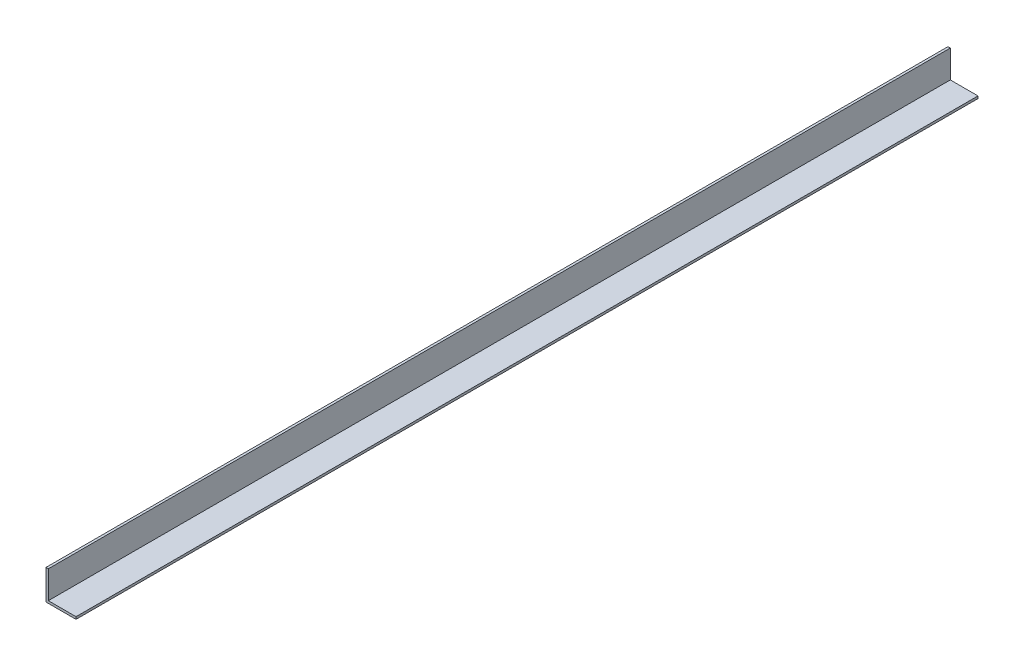
ISO-10303-21;
HEADER;
FILE_DESCRIPTION(('STEP AP214'),'2;1');
FILE_NAME('part.step','',(''),(''),'','','');
FILE_SCHEMA(('AUTOMOTIVE_DESIGN { 1 0 10303 214 1 1 1 1 }'));
ENDSEC;
DATA;
#1=APPLICATION_CONTEXT('core data for automotive mechanical design processes');
#2=APPLICATION_PROTOCOL_DEFINITION('international standard','automotive_design',2000,#1);
#3=PRODUCT_CONTEXT('',#1,'mechanical');
#4=PRODUCT('Part','Part','',(#3));
#5=PRODUCT_RELATED_PRODUCT_CATEGORY('part','',(#4));
#6=PRODUCT_DEFINITION_FORMATION('','',#4);
#7=PRODUCT_DEFINITION_CONTEXT('part definition',#1,'design');
#8=PRODUCT_DEFINITION('design','',#6,#7);
#9=PRODUCT_DEFINITION_SHAPE('','',#8);
#10=(LENGTH_UNIT() NAMED_UNIT(*) SI_UNIT(.MILLI.,.METRE.));
#11=(NAMED_UNIT(*) PLANE_ANGLE_UNIT() SI_UNIT($,.RADIAN.));
#12=(NAMED_UNIT(*) SI_UNIT($,.STERADIAN.) SOLID_ANGLE_UNIT());
#13=UNCERTAINTY_MEASURE_WITH_UNIT(LENGTH_MEASURE(1.E-05),#10,'distance_accuracy_value','');
#14=(GEOMETRIC_REPRESENTATION_CONTEXT(3) GLOBAL_UNCERTAINTY_ASSIGNED_CONTEXT((#13)) GLOBAL_UNIT_ASSIGNED_CONTEXT((#10,
#11,#12)) REPRESENTATION_CONTEXT('',''));
#15=CARTESIAN_POINT('',(0.,0.,0.));
#16=DIRECTION('',(0.,0.,1.));
#17=DIRECTION('',(1.,0.,0.));
#18=AXIS2_PLACEMENT_3D('',#15,#16,#17);
#19=CARTESIAN_POINT('',(15.88,203.,-6100.));
#20=DIRECTION('',(0.,1.,0.));
#21=DIRECTION('',(0.,0.,1.));
#22=AXIS2_PLACEMENT_3D('',#19,#20,#21);
#23=PLANE('',#22);
#24=DIRECTION('',(-1.,0.,0.));
#25=VECTOR('',#24,1.);
#26=CARTESIAN_POINT('',(15.88,203.,0.));
#27=LINE('',#26,#25);
#28=CARTESIAN_POINT('',(15.88,203.,0.));
#29=VERTEX_POINT('',#28);
#30=CARTESIAN_POINT('',(0.,203.,0.));
#31=VERTEX_POINT('',#30);
#32=EDGE_CURVE('E118',#29,#31,#27,.T.);
#33=ORIENTED_EDGE('',*,*,#32,.F.);
#34=DIRECTION('',(0.,0.,1.));
#35=VECTOR('',#34,1.);
#36=CARTESIAN_POINT('',(15.88,203.,-6100.));
#37=LINE('',#36,#35);
#38=CARTESIAN_POINT('',(15.88,203.,-6100.));
#39=VERTEX_POINT('',#38);
#40=EDGE_CURVE('E11',#39,#29,#37,.T.);
#41=ORIENTED_EDGE('',*,*,#40,.F.);
#42=DIRECTION('',(-1.,0.,0.));
#43=VECTOR('',#42,1.);
#44=CARTESIAN_POINT('',(15.88,203.,-6100.));
#45=LINE('',#44,#43);
#46=CARTESIAN_POINT('',(0.,203.,-6100.));
#47=VERTEX_POINT('',#46);
#48=EDGE_CURVE('E132',#39,#47,#45,.T.);
#49=ORIENTED_EDGE('',*,*,#48,.T.);
#50=DIRECTION('',(0.,0.,1.));
#51=VECTOR('',#50,1.);
#52=CARTESIAN_POINT('',(0.,203.,-6100.));
#53=LINE('',#52,#51);
#54=EDGE_CURVE('E36',#47,#31,#53,.T.);
#55=ORIENTED_EDGE('',*,*,#54,.T.);
#56=EDGE_LOOP('',(#33,#41,#49,#55));
#57=FACE_BOUND('',#56,.T.);
#58=ADVANCED_FACE('F33',(#57),#23,.T.);
#59=CARTESIAN_POINT('',(15.88,15.88,-6100.));
#60=DIRECTION('',(1.,0.,0.));
#61=DIRECTION('',(0.,1.,0.));
#62=AXIS2_PLACEMENT_3D('',#59,#60,#61);
#63=PLANE('',#62);
#64=DIRECTION('',(0.,1.,0.));
#65=VECTOR('',#64,1.);
#66=CARTESIAN_POINT('',(15.88,15.88,0.));
#67=LINE('',#66,#65);
#68=CARTESIAN_POINT('',(15.88,15.88,0.));
#69=VERTEX_POINT('',#68);
#70=EDGE_CURVE('E130',#69,#29,#67,.T.);
#71=ORIENTED_EDGE('',*,*,#70,.F.);
#72=DIRECTION('',(0.,0.,1.));
#73=VECTOR('',#72,1.);
#74=CARTESIAN_POINT('',(15.88,15.88,-6100.));
#75=LINE('',#74,#73);
#76=CARTESIAN_POINT('',(15.88,15.88,-6100.));
#77=VERTEX_POINT('',#76);
#78=EDGE_CURVE('E42',#77,#69,#75,.T.);
#79=ORIENTED_EDGE('',*,*,#78,.F.);
#80=DIRECTION('',(0.,1.,0.));
#81=VECTOR('',#80,1.);
#82=CARTESIAN_POINT('',(15.88,15.88,-6100.));
#83=LINE('',#82,#81);
#84=EDGE_CURVE('E108',#77,#39,#83,.T.);
#85=ORIENTED_EDGE('',*,*,#84,.T.);
#86=ORIENTED_EDGE('',*,*,#40,.T.);
#87=EDGE_LOOP('',(#71,#79,#85,#86));
#88=FACE_BOUND('',#87,.T.);
#89=ADVANCED_FACE('F140',(#88),#63,.T.);
#90=CARTESIAN_POINT('',(203.,15.88,-6100.));
#91=DIRECTION('',(0.,1.,0.));
#92=DIRECTION('',(-1.,0.,0.));
#93=AXIS2_PLACEMENT_3D('',#90,#91,#92);
#94=PLANE('',#93);
#95=DIRECTION('',(-1.,0.,0.));
#96=VECTOR('',#95,1.);
#97=CARTESIAN_POINT('',(203.,15.88,0.));
#98=LINE('',#97,#96);
#99=CARTESIAN_POINT('',(203.,15.88,0.));
#100=VERTEX_POINT('',#99);
#101=EDGE_CURVE('E95',#100,#69,#98,.T.);
#102=ORIENTED_EDGE('',*,*,#101,.F.);
#103=DIRECTION('',(0.,0.,1.));
#104=VECTOR('',#103,1.);
#105=CARTESIAN_POINT('',(203.,15.88,-6100.));
#106=LINE('',#105,#104);
#107=CARTESIAN_POINT('',(203.,15.88,-6100.));
#108=VERTEX_POINT('',#107);
#109=EDGE_CURVE('E90',#108,#100,#106,.T.);
#110=ORIENTED_EDGE('',*,*,#109,.F.);
#111=DIRECTION('',(-1.,0.,0.));
#112=VECTOR('',#111,1.);
#113=CARTESIAN_POINT('',(203.,15.88,-6100.));
#114=LINE('',#113,#112);
#115=EDGE_CURVE('E93',#108,#77,#114,.T.);
#116=ORIENTED_EDGE('',*,*,#115,.T.);
#117=ORIENTED_EDGE('',*,*,#78,.T.);
#118=EDGE_LOOP('',(#102,#110,#116,#117));
#119=FACE_BOUND('',#118,.T.);
#120=ADVANCED_FACE('F92',(#119),#94,.T.);
#121=CARTESIAN_POINT('',(203.,0.,-6100.));
#122=DIRECTION('',(1.,0.,0.));
#123=DIRECTION('',(0.,0.,-1.));
#124=AXIS2_PLACEMENT_3D('',#121,#122,#123);
#125=PLANE('',#124);
#126=DIRECTION('',(0.,1.,0.));
#127=VECTOR('',#126,1.);
#128=CARTESIAN_POINT('',(203.,0.,0.));
#129=LINE('',#128,#127);
#130=CARTESIAN_POINT('',(203.,0.,0.));
#131=VERTEX_POINT('',#130);
#132=EDGE_CURVE('E127',#131,#100,#129,.T.);
#133=ORIENTED_EDGE('',*,*,#132,.F.);
#134=DIRECTION('',(0.,0.,1.));
#135=VECTOR('',#134,1.);
#136=CARTESIAN_POINT('',(203.,0.,-6100.));
#137=LINE('',#136,#135);
#138=CARTESIAN_POINT('',(203.,0.,-6100.));
#139=VERTEX_POINT('',#138);
#140=EDGE_CURVE('E100',#139,#131,#137,.T.);
#141=ORIENTED_EDGE('',*,*,#140,.F.);
#142=DIRECTION('',(0.,1.,0.));
#143=VECTOR('',#142,1.);
#144=CARTESIAN_POINT('',(203.,0.,-6100.));
#145=LINE('',#144,#143);
#146=EDGE_CURVE('E106',#139,#108,#145,.T.);
#147=ORIENTED_EDGE('',*,*,#146,.T.);
#148=ORIENTED_EDGE('',*,*,#109,.T.);
#149=EDGE_LOOP('',(#133,#141,#147,#148));
#150=FACE_BOUND('',#149,.T.);
#151=ADVANCED_FACE('F110',(#150),#125,.T.);
#152=CARTESIAN_POINT('',(0.,0.,-6100.));
#153=DIRECTION('',(0.,-1.,0.));
#154=DIRECTION('',(0.,0.,-1.));
#155=AXIS2_PLACEMENT_3D('',#152,#153,#154);
#156=PLANE('',#155);
#157=DIRECTION('',(1.,0.,0.));
#158=VECTOR('',#157,1.);
#159=CARTESIAN_POINT('',(0.,0.,0.));
#160=LINE('',#159,#158);
#161=CARTESIAN_POINT('',(0.,0.,0.));
#162=VERTEX_POINT('',#161);
#163=EDGE_CURVE('E124',#162,#131,#160,.T.);
#164=ORIENTED_EDGE('',*,*,#163,.F.);
#165=DIRECTION('',(0.,0.,1.));
#166=VECTOR('',#165,1.);
#167=CARTESIAN_POINT('',(0.,0.,-6100.));
#168=LINE('',#167,#166);
#169=CARTESIAN_POINT('',(0.,0.,-6100.));
#170=VERTEX_POINT('',#169);
#171=EDGE_CURVE('E135',#170,#162,#168,.T.);
#172=ORIENTED_EDGE('',*,*,#171,.F.);
#173=DIRECTION('',(1.,0.,0.));
#174=VECTOR('',#173,1.);
#175=CARTESIAN_POINT('',(0.,0.,-6100.));
#176=LINE('',#175,#174);
#177=EDGE_CURVE('E111',#170,#139,#176,.T.);
#178=ORIENTED_EDGE('',*,*,#177,.T.);
#179=ORIENTED_EDGE('',*,*,#140,.T.);
#180=EDGE_LOOP('',(#164,#172,#178,#179));
#181=FACE_BOUND('',#180,.T.);
#182=ADVANCED_FACE('F153',(#181),#156,.T.);
#183=CARTESIAN_POINT('',(0.,203.,-6100.));
#184=DIRECTION('',(-1.,0.,0.));
#185=DIRECTION('',(0.,-1.,0.));
#186=AXIS2_PLACEMENT_3D('',#183,#184,#185);
#187=PLANE('',#186);
#188=DIRECTION('',(0.,-1.,0.));
#189=VECTOR('',#188,1.);
#190=CARTESIAN_POINT('',(0.,203.,0.));
#191=LINE('',#190,#189);
#192=EDGE_CURVE('E121',#31,#162,#191,.T.);
#193=ORIENTED_EDGE('',*,*,#192,.F.);
#194=ORIENTED_EDGE('',*,*,#54,.F.);
#195=DIRECTION('',(0.,-1.,0.));
#196=VECTOR('',#195,1.);
#197=CARTESIAN_POINT('',(0.,203.,-6100.));
#198=LINE('',#197,#196);
#199=EDGE_CURVE('E113',#47,#170,#198,.T.);
#200=ORIENTED_EDGE('',*,*,#199,.T.);
#201=ORIENTED_EDGE('',*,*,#171,.T.);
#202=EDGE_LOOP('',(#193,#194,#200,#201));
#203=FACE_BOUND('',#202,.T.);
#204=ADVANCED_FACE('F137',(#203),#187,.T.);
#205=CARTESIAN_POINT('',(0.,0.,-6100.));
#206=DIRECTION('',(0.,0.,1.));
#207=DIRECTION('',(1.,0.,0.));
#208=AXIS2_PLACEMENT_3D('',#205,#206,#207);
#209=PLANE('',#208);
#210=ORIENTED_EDGE('',*,*,#48,.F.);
#211=ORIENTED_EDGE('',*,*,#84,.F.);
#212=ORIENTED_EDGE('',*,*,#115,.F.);
#213=ORIENTED_EDGE('',*,*,#146,.F.);
#214=ORIENTED_EDGE('',*,*,#177,.F.);
#215=ORIENTED_EDGE('',*,*,#199,.F.);
#216=EDGE_LOOP('',(#210,#211,#212,#213,#214,#215));
#217=FACE_BOUND('',#216,.T.);
#218=ADVANCED_FACE('F104',(#217),#209,.F.);
#219=CARTESIAN_POINT('',(0.,0.,0.));
#220=DIRECTION('',(0.,0.,1.));
#221=DIRECTION('',(1.,0.,0.));
#222=AXIS2_PLACEMENT_3D('',#219,#220,#221);
#223=PLANE('',#222);
#224=ORIENTED_EDGE('',*,*,#32,.T.);
#225=ORIENTED_EDGE('',*,*,#192,.T.);
#226=ORIENTED_EDGE('',*,*,#163,.T.);
#227=ORIENTED_EDGE('',*,*,#132,.T.);
#228=ORIENTED_EDGE('',*,*,#101,.T.);
#229=ORIENTED_EDGE('',*,*,#70,.T.);
#230=EDGE_LOOP('',(#224,#225,#226,#227,#228,#229));
#231=FACE_BOUND('',#230,.T.);
#232=ADVANCED_FACE('F139',(#231),#223,.T.);
#233=CLOSED_SHELL('',(#58,#89,#120,#151,#182,#204,#218,#232));
#234=MANIFOLD_SOLID_BREP('B2',#233);
#235=ADVANCED_BREP_SHAPE_REPRESENTATION('',(#18,#234),#14);
#236=SHAPE_DEFINITION_REPRESENTATION(#9,#235);
ENDSEC;
END-ISO-10303-21;
